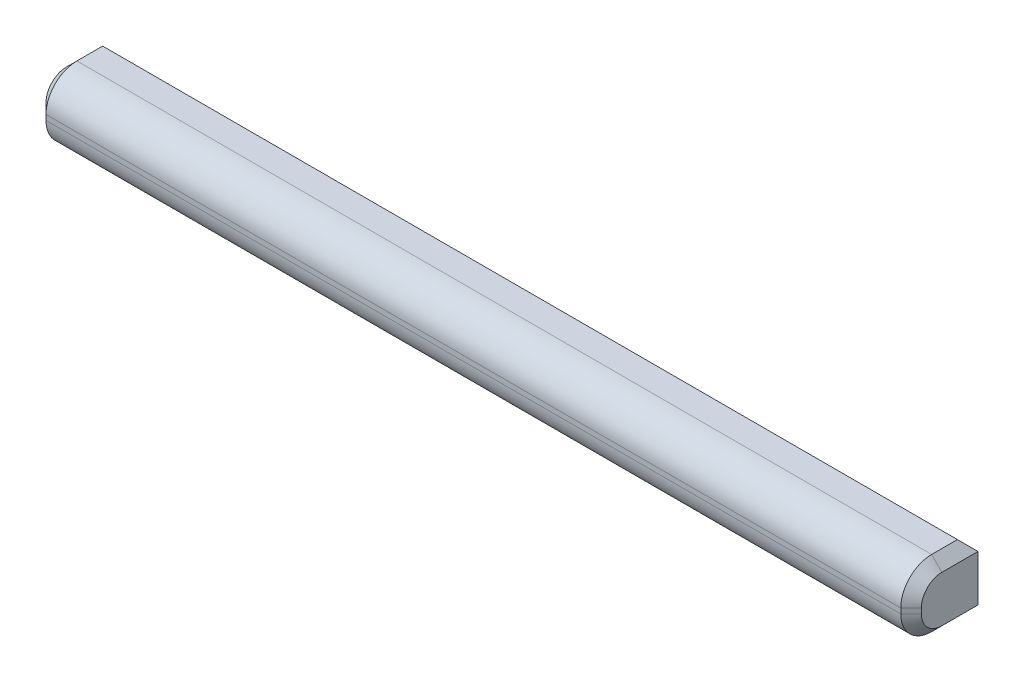
ISO-10303-21;
HEADER;
FILE_DESCRIPTION(('STEP AP214'),'2;1');
FILE_NAME('part.step','',(''),(''),'','','');
FILE_SCHEMA(('AUTOMOTIVE_DESIGN { 1 0 10303 214 1 1 1 1 }'));
ENDSEC;
DATA;
#1=APPLICATION_CONTEXT('core data for automotive mechanical design processes');
#2=APPLICATION_PROTOCOL_DEFINITION('international standard','automotive_design',2000,#1);
#3=PRODUCT_CONTEXT('',#1,'mechanical');
#4=PRODUCT('Part','Part','',(#3));
#5=PRODUCT_RELATED_PRODUCT_CATEGORY('part','',(#4));
#6=PRODUCT_DEFINITION_FORMATION('','',#4);
#7=PRODUCT_DEFINITION_CONTEXT('part definition',#1,'design');
#8=PRODUCT_DEFINITION('design','',#6,#7);
#9=PRODUCT_DEFINITION_SHAPE('','',#8);
#10=(LENGTH_UNIT() NAMED_UNIT(*) SI_UNIT(.MILLI.,.METRE.));
#11=(NAMED_UNIT(*) PLANE_ANGLE_UNIT() SI_UNIT($,.RADIAN.));
#12=(NAMED_UNIT(*) SI_UNIT($,.STERADIAN.) SOLID_ANGLE_UNIT());
#13=UNCERTAINTY_MEASURE_WITH_UNIT(LENGTH_MEASURE(1.E-05),#10,'distance_accuracy_value','');
#14=(GEOMETRIC_REPRESENTATION_CONTEXT(3) GLOBAL_UNCERTAINTY_ASSIGNED_CONTEXT((#13)) GLOBAL_UNIT_ASSIGNED_CONTEXT((#10,
#11,#12)) REPRESENTATION_CONTEXT('',''));
#15=CARTESIAN_POINT('',(0.,0.,0.));
#16=DIRECTION('',(0.,0.,1.));
#17=DIRECTION('',(1.,0.,0.));
#18=AXIS2_PLACEMENT_3D('',#15,#16,#17);
#19=CARTESIAN_POINT('',(85.,0.,0.));
#20=DIRECTION('',(0.,0.,1.));
#21=DIRECTION('',(0.,-1.,0.));
#22=AXIS2_PLACEMENT_3D('',#19,#20,#21);
#23=PLANE('',#22);
#24=DIRECTION('',(0.,1.,0.));
#25=VECTOR('',#24,1.);
#26=CARTESIAN_POINT('',(0.,0.,0.));
#27=LINE('',#26,#25);
#28=CARTESIAN_POINT('',(0.,1.00000000000001,0.));
#29=VERTEX_POINT('',#28);
#30=CARTESIAN_POINT('',(0.,5.49999999999999,0.));
#31=VERTEX_POINT('',#30);
#32=EDGE_CURVE('E186',#29,#31,#27,.T.);
#33=ORIENTED_EDGE('',*,*,#32,.T.);
#34=DIRECTION('',(1.,0.,0.));
#35=VECTOR('',#34,1.);
#36=CARTESIAN_POINT('',(85.,5.49999999999999,0.));
#37=LINE('',#36,#35);
#38=CARTESIAN_POINT('',(85.,5.49999999999999,0.));
#39=VERTEX_POINT('',#38);
#40=EDGE_CURVE('E211',#31,#39,#37,.T.);
#41=ORIENTED_EDGE('',*,*,#40,.T.);
#42=DIRECTION('',(0.,1.,0.));
#43=VECTOR('',#42,1.);
#44=CARTESIAN_POINT('',(85.,0.,0.));
#45=LINE('',#44,#43);
#46=CARTESIAN_POINT('',(85.,1.00000000000001,0.));
#47=VERTEX_POINT('',#46);
#48=EDGE_CURVE('E191',#47,#39,#45,.T.);
#49=ORIENTED_EDGE('',*,*,#48,.F.);
#50=DIRECTION('',(-1.,0.,0.));
#51=VECTOR('',#50,1.);
#52=CARTESIAN_POINT('',(85.,1.00000000000001,0.));
#53=LINE('',#52,#51);
#54=EDGE_CURVE('E209',#47,#29,#53,.T.);
#55=ORIENTED_EDGE('',*,*,#54,.T.);
#56=EDGE_LOOP('',(#33,#41,#49,#55));
#57=FACE_BOUND('',#56,.T.);
#58=ADVANCED_FACE('F34',(#57),#23,.F.);
#59=CARTESIAN_POINT('',(85.,6.5,0.));
#60=DIRECTION('',(0.,-1.,0.));
#61=DIRECTION('',(0.,0.,-1.));
#62=AXIS2_PLACEMENT_3D('',#59,#60,#61);
#63=PLANE('',#62);
#64=DIRECTION('',(-1.,0.,0.));
#65=VECTOR('',#64,1.);
#66=CARTESIAN_POINT('',(85.,6.5,3.5));
#67=LINE('',#66,#65);
#68=CARTESIAN_POINT('',(1.,6.5,3.5));
#69=VERTEX_POINT('',#68);
#70=CARTESIAN_POINT('',(84.,6.5,3.5));
#71=VERTEX_POINT('',#70);
#72=EDGE_CURVE('E126',#69,#71,#67,.F.);
#73=ORIENTED_EDGE('',*,*,#72,.T.);
#74=DIRECTION('',(0.,0.,-1.));
#75=VECTOR('',#74,1.);
#76=CARTESIAN_POINT('',(84.,6.5,0.));
#77=LINE('',#76,#75);
#78=CARTESIAN_POINT('',(84.,6.5,1.));
#79=VERTEX_POINT('',#78);
#80=EDGE_CURVE('E207',#71,#79,#77,.T.);
#81=ORIENTED_EDGE('',*,*,#80,.T.);
#82=DIRECTION('',(-1.,0.,0.));
#83=VECTOR('',#82,1.);
#84=CARTESIAN_POINT('',(85.,6.5,1.));
#85=LINE('',#84,#83);
#86=CARTESIAN_POINT('',(1.,6.5,1.));
#87=VERTEX_POINT('',#86);
#88=EDGE_CURVE('E129',#79,#87,#85,.T.);
#89=ORIENTED_EDGE('',*,*,#88,.T.);
#90=DIRECTION('',(0.,0.,1.));
#91=VECTOR('',#90,1.);
#92=CARTESIAN_POINT('',(1.,6.5,0.));
#93=LINE('',#92,#91);
#94=EDGE_CURVE('E123',#87,#69,#93,.T.);
#95=ORIENTED_EDGE('',*,*,#94,.T.);
#96=EDGE_LOOP('',(#73,#81,#89,#95));
#97=FACE_BOUND('',#96,.T.);
#98=ADVANCED_FACE('F125',(#97),#63,.F.);
#99=CARTESIAN_POINT('',(85.,0.,6.5));
#100=DIRECTION('',(0.,0.,-1.));
#101=DIRECTION('',(-1.,0.,0.));
#102=AXIS2_PLACEMENT_3D('',#99,#100,#101);
#103=PLANE('',#102);
#104=DIRECTION('',(-1.,0.,0.));
#105=VECTOR('',#104,1.);
#106=CARTESIAN_POINT('',(85.,3.,6.5));
#107=LINE('',#106,#105);
#108=CARTESIAN_POINT('',(1.,3.,6.5));
#109=VERTEX_POINT('',#108);
#110=CARTESIAN_POINT('',(84.,3.,6.5));
#111=VERTEX_POINT('',#110);
#112=EDGE_CURVE('E142',#109,#111,#107,.F.);
#113=ORIENTED_EDGE('',*,*,#112,.T.);
#114=DIRECTION('',(0.,1.,0.));
#115=VECTOR('',#114,1.);
#116=CARTESIAN_POINT('',(84.,3.5,6.5));
#117=LINE('',#116,#115);
#118=CARTESIAN_POINT('',(84.,3.5,6.5));
#119=VERTEX_POINT('',#118);
#120=EDGE_CURVE('E235',#111,#119,#117,.T.);
#121=ORIENTED_EDGE('',*,*,#120,.T.);
#122=DIRECTION('',(-1.,0.,0.));
#123=VECTOR('',#122,1.);
#124=CARTESIAN_POINT('',(85.,3.5,6.5));
#125=LINE('',#124,#123);
#126=CARTESIAN_POINT('',(1.,3.5,6.5));
#127=VERTEX_POINT('',#126);
#128=EDGE_CURVE('E202',#119,#127,#125,.T.);
#129=ORIENTED_EDGE('',*,*,#128,.T.);
#130=DIRECTION('',(0.,-1.,0.));
#131=VECTOR('',#130,1.);
#132=CARTESIAN_POINT('',(1.,0.,6.5));
#133=LINE('',#132,#131);
#134=EDGE_CURVE('E233',#127,#109,#133,.T.);
#135=ORIENTED_EDGE('',*,*,#134,.T.);
#136=EDGE_LOOP('',(#113,#121,#129,#135));
#137=FACE_BOUND('',#136,.T.);
#138=ADVANCED_FACE('F265',(#137),#103,.F.);
#139=CARTESIAN_POINT('',(85.,0.,0.));
#140=DIRECTION('',(0.,1.,0.));
#141=DIRECTION('',(0.,0.,1.));
#142=AXIS2_PLACEMENT_3D('',#139,#140,#141);
#143=PLANE('',#142);
#144=DIRECTION('',(1.,0.,0.));
#145=VECTOR('',#144,1.);
#146=CARTESIAN_POINT('',(85.,0.,1.));
#147=LINE('',#146,#145);
#148=CARTESIAN_POINT('',(1.,0.,1.));
#149=VERTEX_POINT('',#148);
#150=CARTESIAN_POINT('',(84.,0.,1.));
#151=VERTEX_POINT('',#150);
#152=EDGE_CURVE('E43',#149,#151,#147,.T.);
#153=ORIENTED_EDGE('',*,*,#152,.T.);
#154=DIRECTION('',(0.,0.,1.));
#155=VECTOR('',#154,1.);
#156=CARTESIAN_POINT('',(84.,0.,3.5));
#157=LINE('',#156,#155);
#158=CARTESIAN_POINT('',(84.,0.,3.5));
#159=VERTEX_POINT('',#158);
#160=EDGE_CURVE('E11',#151,#159,#157,.T.);
#161=ORIENTED_EDGE('',*,*,#160,.T.);
#162=DIRECTION('',(-1.,0.,0.));
#163=VECTOR('',#162,1.);
#164=CARTESIAN_POINT('',(85.,0.,3.5));
#165=LINE('',#164,#163);
#166=CARTESIAN_POINT('',(1.,0.,3.5));
#167=VERTEX_POINT('',#166);
#168=EDGE_CURVE('E198',#159,#167,#165,.T.);
#169=ORIENTED_EDGE('',*,*,#168,.T.);
#170=DIRECTION('',(0.,0.,-1.));
#171=VECTOR('',#170,1.);
#172=CARTESIAN_POINT('',(1.,0.,0.));
#173=LINE('',#172,#171);
#174=EDGE_CURVE('E54',#167,#149,#173,.T.);
#175=ORIENTED_EDGE('',*,*,#174,.T.);
#176=EDGE_LOOP('',(#153,#161,#169,#175));
#177=FACE_BOUND('',#176,.T.);
#178=ADVANCED_FACE('F275',(#177),#143,.F.);
#179=CARTESIAN_POINT('',(85.,0.,0.));
#180=DIRECTION('',(1.,0.,0.));
#181=DIRECTION('',(0.,0.,-1.));
#182=AXIS2_PLACEMENT_3D('',#179,#180,#181);
#183=PLANE('',#182);
#184=ORIENTED_EDGE('',*,*,#48,.T.);
#185=DIRECTION('',(0.,0.,1.));
#186=VECTOR('',#185,1.);
#187=CARTESIAN_POINT('',(85.,5.49999999999999,3.5));
#188=LINE('',#187,#186);
#189=CARTESIAN_POINT('',(85.,5.49999999999999,3.5));
#190=VERTEX_POINT('',#189);
#191=EDGE_CURVE('E221',#39,#190,#188,.T.);
#192=ORIENTED_EDGE('',*,*,#191,.T.);
#193=CARTESIAN_POINT('',(85.,3.5,3.5));
#194=DIRECTION('',(1.,0.,0.));
#195=DIRECTION('',(0.,0.,-1.));
#196=AXIS2_PLACEMENT_3D('',#193,#194,#195);
#197=CIRCLE('',#196,1.99999999999999);
#198=CARTESIAN_POINT('',(85.,3.5,5.49999999999999));
#199=VERTEX_POINT('',#198);
#200=EDGE_CURVE('E219',#190,#199,#197,.T.);
#201=ORIENTED_EDGE('',*,*,#200,.T.);
#202=DIRECTION('',(0.,-1.,0.));
#203=VECTOR('',#202,1.);
#204=CARTESIAN_POINT('',(85.,3.,5.49999999999999));
#205=LINE('',#204,#203);
#206=CARTESIAN_POINT('',(85.,3.,5.49999999999999));
#207=VERTEX_POINT('',#206);
#208=EDGE_CURVE('E217',#199,#207,#205,.T.);
#209=ORIENTED_EDGE('',*,*,#208,.T.);
#210=CARTESIAN_POINT('',(85.,3.,3.5));
#211=DIRECTION('',(1.,0.,0.));
#212=DIRECTION('',(0.,0.,-1.));
#213=AXIS2_PLACEMENT_3D('',#210,#211,#212);
#214=CIRCLE('',#213,1.99999999999999);
#215=CARTESIAN_POINT('',(85.,1.00000000000001,3.5));
#216=VERTEX_POINT('',#215);
#217=EDGE_CURVE('E215',#207,#216,#214,.T.);
#218=ORIENTED_EDGE('',*,*,#217,.T.);
#219=DIRECTION('',(0.,0.,-1.));
#220=VECTOR('',#219,1.);
#221=CARTESIAN_POINT('',(85.,1.00000000000001,0.));
#222=LINE('',#221,#220);
#223=EDGE_CURVE('E213',#216,#47,#222,.T.);
#224=ORIENTED_EDGE('',*,*,#223,.T.);
#225=EDGE_LOOP('',(#184,#192,#201,#209,#218,#224));
#226=FACE_BOUND('',#225,.T.);
#227=ADVANCED_FACE('F249',(#226),#183,.T.);
#228=CARTESIAN_POINT('',(0.,0.,0.));
#229=DIRECTION('',(1.,0.,0.));
#230=DIRECTION('',(0.,0.,-1.));
#231=AXIS2_PLACEMENT_3D('',#228,#229,#230);
#232=PLANE('',#231);
#233=CARTESIAN_POINT('',(0.,3.5,3.5));
#234=DIRECTION('',(1.,0.,0.));
#235=DIRECTION('',(0.,0.,-1.));
#236=AXIS2_PLACEMENT_3D('',#233,#234,#235);
#237=CIRCLE('',#236,1.99999999999999);
#238=CARTESIAN_POINT('',(0.,3.5,5.49999999999999));
#239=VERTEX_POINT('',#238);
#240=CARTESIAN_POINT('',(0.,5.49999999999999,3.5));
#241=VERTEX_POINT('',#240);
#242=EDGE_CURVE('E229',#239,#241,#237,.F.);
#243=ORIENTED_EDGE('',*,*,#242,.T.);
#244=DIRECTION('',(0.,0.,-1.));
#245=VECTOR('',#244,1.);
#246=CARTESIAN_POINT('',(0.,5.49999999999999,0.));
#247=LINE('',#246,#245);
#248=EDGE_CURVE('E153',#241,#31,#247,.T.);
#249=ORIENTED_EDGE('',*,*,#248,.T.);
#250=ORIENTED_EDGE('',*,*,#32,.F.);
#251=DIRECTION('',(0.,0.,1.));
#252=VECTOR('',#251,1.);
#253=CARTESIAN_POINT('',(0.,1.00000000000001,0.));
#254=LINE('',#253,#252);
#255=CARTESIAN_POINT('',(0.,1.00000000000001,3.5));
#256=VERTEX_POINT('',#255);
#257=EDGE_CURVE('E223',#29,#256,#254,.T.);
#258=ORIENTED_EDGE('',*,*,#257,.T.);
#259=CARTESIAN_POINT('',(0.,3.,3.5));
#260=DIRECTION('',(1.,0.,0.));
#261=DIRECTION('',(0.,0.,-1.));
#262=AXIS2_PLACEMENT_3D('',#259,#260,#261);
#263=CIRCLE('',#262,1.99999999999999);
#264=CARTESIAN_POINT('',(0.,3.,5.49999999999999));
#265=VERTEX_POINT('',#264);
#266=EDGE_CURVE('E225',#256,#265,#263,.F.);
#267=ORIENTED_EDGE('',*,*,#266,.T.);
#268=DIRECTION('',(0.,1.,0.));
#269=VECTOR('',#268,1.);
#270=CARTESIAN_POINT('',(0.,0.,5.49999999999999));
#271=LINE('',#270,#269);
#272=EDGE_CURVE('E227',#265,#239,#271,.T.);
#273=ORIENTED_EDGE('',*,*,#272,.T.);
#274=EDGE_LOOP('',(#243,#249,#250,#258,#267,#273));
#275=FACE_BOUND('',#274,.T.);
#276=ADVANCED_FACE('F278',(#275),#232,.F.);
#277=CARTESIAN_POINT('',(85.,3.,3.5));
#278=DIRECTION('',(-1.,0.,0.));
#279=DIRECTION('',(0.,0.,1.));
#280=AXIS2_PLACEMENT_3D('',#277,#278,#279);
#281=CYLINDRICAL_SURFACE('',#280,3.);
#282=ORIENTED_EDGE('',*,*,#168,.F.);
#283=CARTESIAN_POINT('',(84.,3.,3.5));
#284=DIRECTION('',(1.,0.,0.));
#285=DIRECTION('',(0.,0.,-1.));
#286=AXIS2_PLACEMENT_3D('',#283,#284,#285);
#287=CIRCLE('',#286,3.);
#288=EDGE_CURVE('E239',#159,#111,#287,.F.);
#289=ORIENTED_EDGE('',*,*,#288,.T.);
#290=ORIENTED_EDGE('',*,*,#112,.F.);
#291=CARTESIAN_POINT('',(1.,3.,3.5));
#292=DIRECTION('',(1.,0.,0.));
#293=DIRECTION('',(0.,0.,-1.));
#294=AXIS2_PLACEMENT_3D('',#291,#292,#293);
#295=CIRCLE('',#294,3.);
#296=EDGE_CURVE('E237',#109,#167,#295,.T.);
#297=ORIENTED_EDGE('',*,*,#296,.T.);
#298=EDGE_LOOP('',(#282,#289,#290,#297));
#299=FACE_BOUND('',#298,.T.);
#300=ADVANCED_FACE('F262',(#299),#281,.T.);
#301=CARTESIAN_POINT('',(85.,3.5,3.5));
#302=DIRECTION('',(-1.,0.,0.));
#303=DIRECTION('',(0.,0.,1.));
#304=AXIS2_PLACEMENT_3D('',#301,#302,#303);
#305=CYLINDRICAL_SURFACE('',#304,3.);
#306=ORIENTED_EDGE('',*,*,#128,.F.);
#307=CARTESIAN_POINT('',(84.,3.5,3.5));
#308=DIRECTION('',(1.,0.,0.));
#309=DIRECTION('',(0.,0.,-1.));
#310=AXIS2_PLACEMENT_3D('',#307,#308,#309);
#311=CIRCLE('',#310,3.);
#312=EDGE_CURVE('E141',#119,#71,#311,.F.);
#313=ORIENTED_EDGE('',*,*,#312,.T.);
#314=ORIENTED_EDGE('',*,*,#72,.F.);
#315=CARTESIAN_POINT('',(1.,3.5,3.5));
#316=DIRECTION('',(1.,0.,0.));
#317=DIRECTION('',(0.,0.,-1.));
#318=AXIS2_PLACEMENT_3D('',#315,#316,#317);
#319=CIRCLE('',#318,3.);
#320=EDGE_CURVE('E138',#69,#127,#319,.T.);
#321=ORIENTED_EDGE('',*,*,#320,.T.);
#322=EDGE_LOOP('',(#306,#313,#314,#321));
#323=FACE_BOUND('',#322,.T.);
#324=ADVANCED_FACE('F137',(#323),#305,.T.);
#325=CARTESIAN_POINT('',(85.,1.00000000000001,0.));
#326=DIRECTION('',(0.,0.707106781186545,0.70710678118655));
#327=DIRECTION('',(-1.,0.,0.));
#328=AXIS2_PLACEMENT_3D('',#325,#326,#327);
#329=PLANE('',#328);
#330=DIRECTION('',(0.577350269189625,-0.577350269189629,0.577350269189624));
#331=VECTOR('',#330,1.);
#332=CARTESIAN_POINT('',(0.666666666666669,0.333333333333334,0.666666666666669));
#333=LINE('',#332,#331);
#334=EDGE_CURVE('E180',#29,#149,#333,.T.);
#335=ORIENTED_EDGE('',*,*,#334,.F.);
#336=ORIENTED_EDGE('',*,*,#54,.F.);
#337=DIRECTION('',(0.577350269189625,0.577350269189629,-0.577350269189624));
#338=VECTOR('',#337,1.);
#339=CARTESIAN_POINT('',(85.,1.00000000000001,0.));
#340=LINE('',#339,#338);
#341=EDGE_CURVE('E38',#151,#47,#340,.T.);
#342=ORIENTED_EDGE('',*,*,#341,.F.);
#343=ORIENTED_EDGE('',*,*,#152,.F.);
#344=EDGE_LOOP('',(#335,#336,#342,#343));
#345=FACE_BOUND('',#344,.T.);
#346=ADVANCED_FACE('F36',(#345),#329,.F.);
#347=CARTESIAN_POINT('',(85.,1.00000000000001,0.));
#348=DIRECTION('',(0.70710678118655,-0.707106781186545,0.));
#349=DIRECTION('',(0.,0.,1.));
#350=AXIS2_PLACEMENT_3D('',#347,#348,#349);
#351=PLANE('',#350);
#352=ORIENTED_EDGE('',*,*,#341,.T.);
#353=ORIENTED_EDGE('',*,*,#223,.F.);
#354=DIRECTION('',(0.707106781186545,0.70710678118655,0.));
#355=VECTOR('',#354,1.);
#356=CARTESIAN_POINT('',(84.,0.,3.5));
#357=LINE('',#356,#355);
#358=EDGE_CURVE('E178',#159,#216,#357,.T.);
#359=ORIENTED_EDGE('',*,*,#358,.F.);
#360=ORIENTED_EDGE('',*,*,#160,.F.);
#361=EDGE_LOOP('',(#352,#353,#359,#360));
#362=FACE_BOUND('',#361,.T.);
#363=ADVANCED_FACE('F253',(#362),#351,.T.);
#364=CARTESIAN_POINT('',(1.,0.,0.));
#365=DIRECTION('',(0.70710678118655,0.707106781186545,0.));
#366=DIRECTION('',(0.,0.,-1.));
#367=AXIS2_PLACEMENT_3D('',#364,#365,#366);
#368=PLANE('',#367);
#369=ORIENTED_EDGE('',*,*,#334,.T.);
#370=ORIENTED_EDGE('',*,*,#174,.F.);
#371=DIRECTION('',(0.707106781186545,-0.70710678118655,0.));
#372=VECTOR('',#371,1.);
#373=CARTESIAN_POINT('',(0.,1.00000000000001,3.5));
#374=LINE('',#373,#372);
#375=EDGE_CURVE('E175',#256,#167,#374,.T.);
#376=ORIENTED_EDGE('',*,*,#375,.F.);
#377=ORIENTED_EDGE('',*,*,#257,.F.);
#378=EDGE_LOOP('',(#369,#370,#376,#377));
#379=FACE_BOUND('',#378,.T.);
#380=ADVANCED_FACE('F276',(#379),#368,.F.);
#381=CARTESIAN_POINT('',(85.,3.,3.5));
#382=DIRECTION('',(-1.,0.,0.));
#383=DIRECTION('',(0.,0.,1.));
#384=AXIS2_PLACEMENT_3D('',#381,#382,#383);
#385=CONICAL_SURFACE('',#384,1.99999999999999,0.785398163397452);
#386=ORIENTED_EDGE('',*,*,#358,.T.);
#387=ORIENTED_EDGE('',*,*,#217,.F.);
#388=DIRECTION('',(0.707106781186545,0.,-0.70710678118655));
#389=VECTOR('',#388,1.);
#390=CARTESIAN_POINT('',(84.,3.,6.5));
#391=LINE('',#390,#389);
#392=EDGE_CURVE('E172',#111,#207,#391,.T.);
#393=ORIENTED_EDGE('',*,*,#392,.F.);
#394=ORIENTED_EDGE('',*,*,#288,.F.);
#395=EDGE_LOOP('',(#386,#387,#393,#394));
#396=FACE_BOUND('',#395,.T.);
#397=ADVANCED_FACE('F256',(#396),#385,.T.);
#398=CARTESIAN_POINT('',(0.,3.,3.5));
#399=DIRECTION('',(1.,0.,0.));
#400=DIRECTION('',(0.,0.,-1.));
#401=AXIS2_PLACEMENT_3D('',#398,#399,#400);
#402=CONICAL_SURFACE('',#401,1.99999999999999,0.785398163397452);
#403=ORIENTED_EDGE('',*,*,#375,.T.);
#404=ORIENTED_EDGE('',*,*,#296,.F.);
#405=DIRECTION('',(0.707106781186545,0.,0.70710678118655));
#406=VECTOR('',#405,1.);
#407=CARTESIAN_POINT('',(0.,3.,5.49999999999999));
#408=LINE('',#407,#406);
#409=EDGE_CURVE('E169',#265,#109,#408,.T.);
#410=ORIENTED_EDGE('',*,*,#409,.F.);
#411=ORIENTED_EDGE('',*,*,#266,.F.);
#412=EDGE_LOOP('',(#403,#404,#410,#411));
#413=FACE_BOUND('',#412,.T.);
#414=ADVANCED_FACE('F273',(#413),#402,.T.);
#415=CARTESIAN_POINT('',(85.,0.,5.49999999999999));
#416=DIRECTION('',(0.70710678118655,0.,0.707106781186545));
#417=DIRECTION('',(0.,1.,0.));
#418=AXIS2_PLACEMENT_3D('',#415,#416,#417);
#419=PLANE('',#418);
#420=ORIENTED_EDGE('',*,*,#392,.T.);
#421=ORIENTED_EDGE('',*,*,#208,.F.);
#422=DIRECTION('',(0.707106781186545,0.,-0.70710678118655));
#423=VECTOR('',#422,1.);
#424=CARTESIAN_POINT('',(84.,3.5,6.5));
#425=LINE('',#424,#423);
#426=EDGE_CURVE('E166',#119,#199,#425,.T.);
#427=ORIENTED_EDGE('',*,*,#426,.F.);
#428=ORIENTED_EDGE('',*,*,#120,.F.);
#429=EDGE_LOOP('',(#420,#421,#427,#428));
#430=FACE_BOUND('',#429,.T.);
#431=ADVANCED_FACE('F312',(#430),#419,.T.);
#432=CARTESIAN_POINT('',(1.,0.,6.5));
#433=DIRECTION('',(0.70710678118655,0.,-0.707106781186545));
#434=DIRECTION('',(0.,-1.,0.));
#435=AXIS2_PLACEMENT_3D('',#432,#433,#434);
#436=PLANE('',#435);
#437=ORIENTED_EDGE('',*,*,#409,.T.);
#438=ORIENTED_EDGE('',*,*,#134,.F.);
#439=DIRECTION('',(0.707106781186545,0.,0.70710678118655));
#440=VECTOR('',#439,1.);
#441=CARTESIAN_POINT('',(0.,3.5,5.49999999999999));
#442=LINE('',#441,#440);
#443=EDGE_CURVE('E152',#239,#127,#442,.T.);
#444=ORIENTED_EDGE('',*,*,#443,.F.);
#445=ORIENTED_EDGE('',*,*,#272,.F.);
#446=EDGE_LOOP('',(#437,#438,#444,#445));
#447=FACE_BOUND('',#446,.T.);
#448=ADVANCED_FACE('F268',(#447),#436,.F.);
#449=CARTESIAN_POINT('',(85.,3.5,3.5));
#450=DIRECTION('',(-1.,0.,0.));
#451=DIRECTION('',(0.,0.,1.));
#452=AXIS2_PLACEMENT_3D('',#449,#450,#451);
#453=CONICAL_SURFACE('',#452,1.99999999999999,0.785398163397452);
#454=ORIENTED_EDGE('',*,*,#426,.T.);
#455=ORIENTED_EDGE('',*,*,#200,.F.);
#456=DIRECTION('',(0.707106781186545,-0.70710678118655,0.));
#457=VECTOR('',#456,1.);
#458=CARTESIAN_POINT('',(84.,6.5,3.5));
#459=LINE('',#458,#457);
#460=EDGE_CURVE('E156',#71,#190,#459,.T.);
#461=ORIENTED_EDGE('',*,*,#460,.F.);
#462=ORIENTED_EDGE('',*,*,#312,.F.);
#463=EDGE_LOOP('',(#454,#455,#461,#462));
#464=FACE_BOUND('',#463,.T.);
#465=ADVANCED_FACE('F306',(#464),#453,.T.);
#466=CARTESIAN_POINT('',(0.,3.5,3.5));
#467=DIRECTION('',(1.,0.,0.));
#468=DIRECTION('',(0.,0.,-1.));
#469=AXIS2_PLACEMENT_3D('',#466,#467,#468);
#470=CONICAL_SURFACE('',#469,1.99999999999999,0.785398163397452);
#471=ORIENTED_EDGE('',*,*,#443,.T.);
#472=ORIENTED_EDGE('',*,*,#320,.F.);
#473=DIRECTION('',(0.707106781186545,0.70710678118655,0.));
#474=VECTOR('',#473,1.);
#475=CARTESIAN_POINT('',(0.,5.49999999999999,3.5));
#476=LINE('',#475,#474);
#477=EDGE_CURVE('E149',#241,#69,#476,.T.);
#478=ORIENTED_EDGE('',*,*,#477,.F.);
#479=ORIENTED_EDGE('',*,*,#242,.F.);
#480=EDGE_LOOP('',(#471,#472,#478,#479));
#481=FACE_BOUND('',#480,.T.);
#482=ADVANCED_FACE('F147',(#481),#470,.T.);
#483=CARTESIAN_POINT('',(85.,5.49999999999999,0.));
#484=DIRECTION('',(0.70710678118655,0.707106781186545,0.));
#485=DIRECTION('',(0.,0.,-1.));
#486=AXIS2_PLACEMENT_3D('',#483,#484,#485);
#487=PLANE('',#486);
#488=ORIENTED_EDGE('',*,*,#460,.T.);
#489=ORIENTED_EDGE('',*,*,#191,.F.);
#490=DIRECTION('',(0.577350269189624,-0.577350269189629,-0.577350269189625));
#491=VECTOR('',#490,1.);
#492=CARTESIAN_POINT('',(85.,5.49999999999999,0.));
#493=LINE('',#492,#491);
#494=EDGE_CURVE('E157',#79,#39,#493,.T.);
#495=ORIENTED_EDGE('',*,*,#494,.F.);
#496=ORIENTED_EDGE('',*,*,#80,.F.);
#497=EDGE_LOOP('',(#488,#489,#495,#496));
#498=FACE_BOUND('',#497,.T.);
#499=ADVANCED_FACE('F300',(#498),#487,.T.);
#500=CARTESIAN_POINT('',(1.,6.5,0.));
#501=DIRECTION('',(0.70710678118655,-0.707106781186545,0.));
#502=DIRECTION('',(0.,0.,1.));
#503=AXIS2_PLACEMENT_3D('',#500,#501,#502);
#504=PLANE('',#503);
#505=ORIENTED_EDGE('',*,*,#477,.T.);
#506=ORIENTED_EDGE('',*,*,#94,.F.);
#507=DIRECTION('',(-0.577350269189624,-0.577350269189629,-0.577350269189625));
#508=VECTOR('',#507,1.);
#509=CARTESIAN_POINT('',(0.666666666666669,6.16666666666667,0.666666666666669));
#510=LINE('',#509,#508);
#511=EDGE_CURVE('E161',#31,#87,#510,.F.);
#512=ORIENTED_EDGE('',*,*,#511,.F.);
#513=ORIENTED_EDGE('',*,*,#248,.F.);
#514=EDGE_LOOP('',(#505,#506,#512,#513));
#515=FACE_BOUND('',#514,.T.);
#516=ADVANCED_FACE('F155',(#515),#504,.F.);
#517=CARTESIAN_POINT('',(85.,6.5,1.));
#518=DIRECTION('',(0.,-0.707106781186545,0.70710678118655));
#519=DIRECTION('',(-1.,0.,0.));
#520=AXIS2_PLACEMENT_3D('',#517,#518,#519);
#521=PLANE('',#520);
#522=ORIENTED_EDGE('',*,*,#494,.T.);
#523=ORIENTED_EDGE('',*,*,#40,.F.);
#524=ORIENTED_EDGE('',*,*,#511,.T.);
#525=ORIENTED_EDGE('',*,*,#88,.F.);
#526=EDGE_LOOP('',(#522,#523,#524,#525));
#527=FACE_BOUND('',#526,.T.);
#528=ADVANCED_FACE('F243',(#527),#521,.F.);
#529=CLOSED_SHELL('',(#58,#98,#138,#178,#227,#276,#300,#324,#346,#363,#380,#397,#414,#431,#448,
#465,#482,#499,#516,#528));
#530=MANIFOLD_SOLID_BREP('B2',#529);
#531=ADVANCED_BREP_SHAPE_REPRESENTATION('',(#18,#530),#14);
#532=SHAPE_DEFINITION_REPRESENTATION(#9,#531);
ENDSEC;
END-ISO-10303-21;
